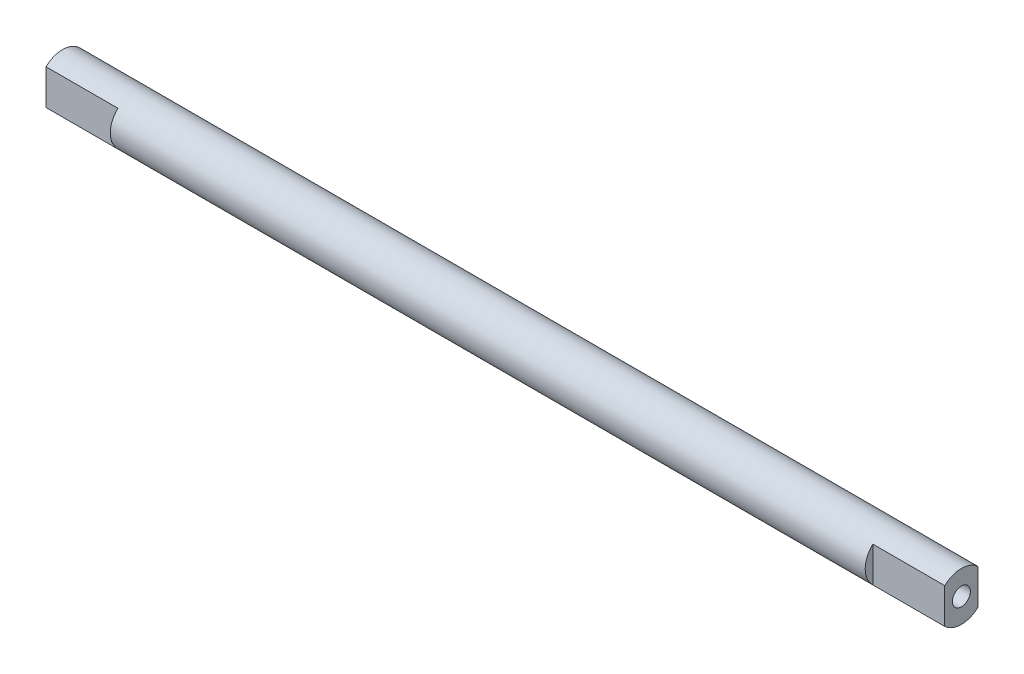
ISO-10303-21;
HEADER;
FILE_DESCRIPTION(('STEP AP214'),'2;1');
FILE_NAME('part.step','',(''),(''),'','','');
FILE_SCHEMA(('AUTOMOTIVE_DESIGN { 1 0 10303 214 1 1 1 1 }'));
ENDSEC;
DATA;
#1=APPLICATION_CONTEXT('core data for automotive mechanical design processes');
#2=APPLICATION_PROTOCOL_DEFINITION('international standard','automotive_design',2000,#1);
#3=PRODUCT_CONTEXT('',#1,'mechanical');
#4=PRODUCT('Part','Part','',(#3));
#5=PRODUCT_RELATED_PRODUCT_CATEGORY('part','',(#4));
#6=PRODUCT_DEFINITION_FORMATION('','',#4);
#7=PRODUCT_DEFINITION_CONTEXT('part definition',#1,'design');
#8=PRODUCT_DEFINITION('design','',#6,#7);
#9=PRODUCT_DEFINITION_SHAPE('','',#8);
#10=(LENGTH_UNIT() NAMED_UNIT(*) SI_UNIT(.MILLI.,.METRE.));
#11=(NAMED_UNIT(*) PLANE_ANGLE_UNIT() SI_UNIT($,.RADIAN.));
#12=(NAMED_UNIT(*) SI_UNIT($,.STERADIAN.) SOLID_ANGLE_UNIT());
#13=UNCERTAINTY_MEASURE_WITH_UNIT(LENGTH_MEASURE(1.E-05),#10,'distance_accuracy_value','');
#14=(GEOMETRIC_REPRESENTATION_CONTEXT(3) GLOBAL_UNCERTAINTY_ASSIGNED_CONTEXT((#13)) GLOBAL_UNIT_ASSIGNED_CONTEXT((#10,
#11,#12)) REPRESENTATION_CONTEXT('',''));
#15=CARTESIAN_POINT('',(0.,0.,0.));
#16=DIRECTION('',(0.,0.,1.));
#17=DIRECTION('',(1.,0.,0.));
#18=AXIS2_PLACEMENT_3D('',#15,#16,#17);
#19=CARTESIAN_POINT('',(50.,0.,0.));
#20=DIRECTION('',(-1.,0.,0.));
#21=DIRECTION('',(0.,0.,1.));
#22=AXIS2_PLACEMENT_3D('',#19,#20,#21);
#23=CYLINDRICAL_SURFACE('',#22,2.7);
#24=CARTESIAN_POINT('',(50.,0.,0.));
#25=DIRECTION('',(1.,0.,0.));
#26=DIRECTION('',(0.,0.,-1.));
#27=AXIS2_PLACEMENT_3D('',#24,#25,#26);
#28=CIRCLE('',#27,2.7);
#29=CARTESIAN_POINT('',(50.,-1.96659604392971,1.85));
#30=VERTEX_POINT('',#29);
#31=CARTESIAN_POINT('',(50.,-1.96659604392971,-1.85));
#32=VERTEX_POINT('',#31);
#33=EDGE_CURVE('E52',#30,#32,#28,.T.);
#34=ORIENTED_EDGE('',*,*,#33,.F.);
#35=DIRECTION('',(1.,0.,0.));
#36=VECTOR('',#35,1.);
#37=CARTESIAN_POINT('',(42.,-1.96659604392971,1.85));
#38=LINE('',#37,#36);
#39=CARTESIAN_POINT('',(42.,-1.96659604392971,1.85));
#40=VERTEX_POINT('',#39);
#41=EDGE_CURVE('E164',#40,#30,#38,.T.);
#42=ORIENTED_EDGE('',*,*,#41,.F.);
#43=CARTESIAN_POINT('',(42.,0.,0.));
#44=DIRECTION('',(1.,0.,0.));
#45=DIRECTION('',(0.,0.,-1.));
#46=AXIS2_PLACEMENT_3D('',#43,#44,#45);
#47=CIRCLE('',#46,2.7);
#48=CARTESIAN_POINT('',(42.,1.96659604392971,1.85));
#49=VERTEX_POINT('',#48);
#50=EDGE_CURVE('E156',#49,#40,#47,.T.);
#51=ORIENTED_EDGE('',*,*,#50,.F.);
#52=DIRECTION('',(1.,0.,0.));
#53=VECTOR('',#52,1.);
#54=CARTESIAN_POINT('',(42.,1.96659604392971,1.85));
#55=LINE('',#54,#53);
#56=CARTESIAN_POINT('',(50.,1.96659604392971,1.85));
#57=VERTEX_POINT('',#56);
#58=EDGE_CURVE('E168',#49,#57,#55,.T.);
#59=ORIENTED_EDGE('',*,*,#58,.T.);
#60=CARTESIAN_POINT('',(50.,1.96659604392971,-1.85));
#61=VERTEX_POINT('',#60);
#62=EDGE_CURVE('E11',#61,#57,#28,.T.);
#63=ORIENTED_EDGE('',*,*,#62,.F.);
#64=DIRECTION('',(1.,0.,0.));
#65=VECTOR('',#64,1.);
#66=CARTESIAN_POINT('',(42.,1.96659604392971,-1.85));
#67=LINE('',#66,#65);
#68=CARTESIAN_POINT('',(42.,1.96659604392971,-1.85));
#69=VERTEX_POINT('',#68);
#70=EDGE_CURVE('E182',#69,#61,#67,.T.);
#71=ORIENTED_EDGE('',*,*,#70,.F.);
#72=CARTESIAN_POINT('',(42.,0.,0.));
#73=DIRECTION('',(1.,0.,0.));
#74=DIRECTION('',(0.,0.,-1.));
#75=AXIS2_PLACEMENT_3D('',#72,#73,#74);
#76=CIRCLE('',#75,2.7);
#77=CARTESIAN_POINT('',(42.,-1.96659604392971,-1.85));
#78=VERTEX_POINT('',#77);
#79=EDGE_CURVE('E175',#78,#69,#76,.T.);
#80=ORIENTED_EDGE('',*,*,#79,.F.);
#81=DIRECTION('',(1.,0.,0.));
#82=VECTOR('',#81,1.);
#83=CARTESIAN_POINT('',(42.,-1.96659604392971,-1.85));
#84=LINE('',#83,#82);
#85=EDGE_CURVE('E167',#78,#32,#84,.T.);
#86=ORIENTED_EDGE('',*,*,#85,.T.);
#87=EDGE_LOOP('',(#34,#42,#51,#59,#63,#71,#80,#86));
#88=FACE_BOUND('',#87,.T.);
#89=DIRECTION('',(-1.,0.,0.));
#90=VECTOR('',#89,1.);
#91=CARTESIAN_POINT('',(-42.,1.96659604392971,1.85));
#92=LINE('',#91,#90);
#93=CARTESIAN_POINT('',(-42.,1.96659604392971,1.85));
#94=VERTEX_POINT('',#93);
#95=CARTESIAN_POINT('',(-50.,1.96659604392971,1.85));
#96=VERTEX_POINT('',#95);
#97=EDGE_CURVE('E67',#94,#96,#92,.T.);
#98=ORIENTED_EDGE('',*,*,#97,.F.);
#99=CARTESIAN_POINT('',(-42.,0.,0.));
#100=DIRECTION('',(1.,0.,0.));
#101=DIRECTION('',(0.,0.,-1.));
#102=AXIS2_PLACEMENT_3D('',#99,#100,#101);
#103=CIRCLE('',#102,2.7);
#104=CARTESIAN_POINT('',(-42.,-1.96659604392971,1.85));
#105=VERTEX_POINT('',#104);
#106=EDGE_CURVE('E115',#94,#105,#103,.T.);
#107=ORIENTED_EDGE('',*,*,#106,.T.);
#108=DIRECTION('',(-1.,0.,0.));
#109=VECTOR('',#108,1.);
#110=CARTESIAN_POINT('',(-42.,-1.96659604392971,1.85));
#111=LINE('',#110,#109);
#112=CARTESIAN_POINT('',(-50.,-1.96659604392971,1.85));
#113=VERTEX_POINT('',#112);
#114=EDGE_CURVE('E111',#105,#113,#111,.T.);
#115=ORIENTED_EDGE('',*,*,#114,.T.);
#116=CARTESIAN_POINT('',(-50.,0.,0.));
#117=DIRECTION('',(1.,0.,0.));
#118=DIRECTION('',(0.,0.,-1.));
#119=AXIS2_PLACEMENT_3D('',#116,#117,#118);
#120=CIRCLE('',#119,2.7);
#121=CARTESIAN_POINT('',(-50.,-1.96659604392971,-1.85));
#122=VERTEX_POINT('',#121);
#123=EDGE_CURVE('E172',#113,#122,#120,.T.);
#124=ORIENTED_EDGE('',*,*,#123,.T.);
#125=DIRECTION('',(-1.,0.,0.));
#126=VECTOR('',#125,1.);
#127=CARTESIAN_POINT('',(-42.,-1.96659604392971,-1.85));
#128=LINE('',#127,#126);
#129=CARTESIAN_POINT('',(-42.,-1.96659604392971,-1.85));
#130=VERTEX_POINT('',#129);
#131=EDGE_CURVE('E59',#130,#122,#128,.T.);
#132=ORIENTED_EDGE('',*,*,#131,.F.);
#133=CARTESIAN_POINT('',(-42.,0.,0.));
#134=DIRECTION('',(1.,0.,0.));
#135=DIRECTION('',(0.,0.,-1.));
#136=AXIS2_PLACEMENT_3D('',#133,#134,#135);
#137=CIRCLE('',#136,2.7);
#138=CARTESIAN_POINT('',(-42.,1.96659604392971,-1.85));
#139=VERTEX_POINT('',#138);
#140=EDGE_CURVE('E132',#130,#139,#137,.T.);
#141=ORIENTED_EDGE('',*,*,#140,.T.);
#142=DIRECTION('',(-1.,0.,0.));
#143=VECTOR('',#142,1.);
#144=CARTESIAN_POINT('',(-42.,1.96659604392971,-1.85));
#145=LINE('',#144,#143);
#146=CARTESIAN_POINT('',(-50.,1.96659604392971,-1.85));
#147=VERTEX_POINT('',#146);
#148=EDGE_CURVE('E143',#139,#147,#145,.T.);
#149=ORIENTED_EDGE('',*,*,#148,.T.);
#150=EDGE_CURVE('E46',#147,#96,#120,.T.);
#151=ORIENTED_EDGE('',*,*,#150,.T.);
#152=EDGE_LOOP('',(#98,#107,#115,#124,#132,#141,#149,#151));
#153=FACE_BOUND('',#152,.T.);
#154=ADVANCED_FACE('F43',(#88,#153),#23,.T.);
#155=CARTESIAN_POINT('',(-50.,0.,0.));
#156=DIRECTION('',(1.,0.,0.));
#157=DIRECTION('',(0.,0.,-1.));
#158=AXIS2_PLACEMENT_3D('',#155,#156,#157);
#159=PLANE('',#158);
#160=CARTESIAN_POINT('',(-50.,0.,0.));
#161=DIRECTION('',(1.,0.,0.));
#162=DIRECTION('',(0.,0.,-1.));
#163=AXIS2_PLACEMENT_3D('',#160,#161,#162);
#164=CIRCLE('',#163,1.);
#165=CARTESIAN_POINT('',(-50.,0.,-1.));
#166=VERTEX_POINT('',#165);
#167=EDGE_CURVE('E388',#166,#166,#164,.T.);
#168=ORIENTED_EDGE('',*,*,#167,.T.);
#169=EDGE_LOOP('',(#168));
#170=FACE_BOUND('',#169,.T.);
#171=DIRECTION('',(0.,1.,0.));
#172=VECTOR('',#171,1.);
#173=CARTESIAN_POINT('',(-50.,1.96659604392971,1.85));
#174=LINE('',#173,#172);
#175=EDGE_CURVE('E120',#113,#96,#174,.T.);
#176=ORIENTED_EDGE('',*,*,#175,.T.);
#177=ORIENTED_EDGE('',*,*,#150,.F.);
#178=DIRECTION('',(0.,-1.,0.));
#179=VECTOR('',#178,1.);
#180=CARTESIAN_POINT('',(-50.,1.96659604392971,-1.85));
#181=LINE('',#180,#179);
#182=EDGE_CURVE('E137',#147,#122,#181,.T.);
#183=ORIENTED_EDGE('',*,*,#182,.T.);
#184=ORIENTED_EDGE('',*,*,#123,.F.);
#185=EDGE_LOOP('',(#176,#177,#183,#184));
#186=FACE_BOUND('',#185,.T.);
#187=ADVANCED_FACE('F222',(#170,#186),#159,.F.);
#188=CARTESIAN_POINT('',(50.,0.,0.));
#189=DIRECTION('',(1.,0.,0.));
#190=DIRECTION('',(0.,0.,-1.));
#191=AXIS2_PLACEMENT_3D('',#188,#189,#190);
#192=PLANE('',#191);
#193=CARTESIAN_POINT('',(50.,0.,0.));
#194=DIRECTION('',(1.,0.,0.));
#195=DIRECTION('',(0.,0.,-1.));
#196=AXIS2_PLACEMENT_3D('',#193,#194,#195);
#197=CIRCLE('',#196,1.);
#198=CARTESIAN_POINT('',(50.,0.,-1.));
#199=VERTEX_POINT('',#198);
#200=EDGE_CURVE('E128',#199,#199,#197,.T.);
#201=ORIENTED_EDGE('',*,*,#200,.F.);
#202=EDGE_LOOP('',(#201));
#203=FACE_BOUND('',#202,.T.);
#204=DIRECTION('',(0.,1.,0.));
#205=VECTOR('',#204,1.);
#206=CARTESIAN_POINT('',(50.,1.96659604392971,1.85));
#207=LINE('',#206,#205);
#208=EDGE_CURVE('E160',#30,#57,#207,.T.);
#209=ORIENTED_EDGE('',*,*,#208,.F.);
#210=ORIENTED_EDGE('',*,*,#33,.T.);
#211=DIRECTION('',(0.,-1.,0.));
#212=VECTOR('',#211,1.);
#213=CARTESIAN_POINT('',(50.,1.96659604392971,-1.85));
#214=LINE('',#213,#212);
#215=EDGE_CURVE('E152',#61,#32,#214,.T.);
#216=ORIENTED_EDGE('',*,*,#215,.F.);
#217=ORIENTED_EDGE('',*,*,#62,.T.);
#218=EDGE_LOOP('',(#209,#210,#216,#217));
#219=FACE_BOUND('',#218,.T.);
#220=ADVANCED_FACE('F200',(#203,#219),#192,.T.);
#221=CARTESIAN_POINT('',(42.,1.96659604392971,-1.85));
#222=DIRECTION('',(0.,0.,1.));
#223=DIRECTION('',(1.,0.,0.));
#224=AXIS2_PLACEMENT_3D('',#221,#222,#223);
#225=PLANE('',#224);
#226=ORIENTED_EDGE('',*,*,#215,.T.);
#227=ORIENTED_EDGE('',*,*,#85,.F.);
#228=DIRECTION('',(0.,-1.,0.));
#229=VECTOR('',#228,1.);
#230=CARTESIAN_POINT('',(42.,1.96659604392971,-1.85));
#231=LINE('',#230,#229);
#232=EDGE_CURVE('E178',#69,#78,#231,.T.);
#233=ORIENTED_EDGE('',*,*,#232,.F.);
#234=ORIENTED_EDGE('',*,*,#70,.T.);
#235=EDGE_LOOP('',(#226,#227,#233,#234));
#236=FACE_BOUND('',#235,.T.);
#237=ADVANCED_FACE('F193',(#236),#225,.F.);
#238=CARTESIAN_POINT('',(42.,0.,0.));
#239=DIRECTION('',(1.,0.,0.));
#240=DIRECTION('',(0.,0.,-1.));
#241=AXIS2_PLACEMENT_3D('',#238,#239,#240);
#242=PLANE('',#241);
#243=ORIENTED_EDGE('',*,*,#79,.T.);
#244=ORIENTED_EDGE('',*,*,#232,.T.);
#245=EDGE_LOOP('',(#243,#244));
#246=FACE_BOUND('',#245,.T.);
#247=ADVANCED_FACE('F219',(#246),#242,.T.);
#248=CARTESIAN_POINT('',(42.,1.96659604392971,1.85));
#249=DIRECTION('',(0.,0.,-1.));
#250=DIRECTION('',(-1.,0.,0.));
#251=AXIS2_PLACEMENT_3D('',#248,#249,#250);
#252=PLANE('',#251);
#253=ORIENTED_EDGE('',*,*,#208,.T.);
#254=ORIENTED_EDGE('',*,*,#58,.F.);
#255=DIRECTION('',(0.,1.,0.));
#256=VECTOR('',#255,1.);
#257=CARTESIAN_POINT('',(42.,1.96659604392971,1.85));
#258=LINE('',#257,#256);
#259=EDGE_CURVE('E159',#40,#49,#258,.T.);
#260=ORIENTED_EDGE('',*,*,#259,.F.);
#261=ORIENTED_EDGE('',*,*,#41,.T.);
#262=EDGE_LOOP('',(#253,#254,#260,#261));
#263=FACE_BOUND('',#262,.T.);
#264=ADVANCED_FACE('F206',(#263),#252,.F.);
#265=CARTESIAN_POINT('',(42.,0.,0.));
#266=DIRECTION('',(1.,0.,0.));
#267=DIRECTION('',(0.,0.,-1.));
#268=AXIS2_PLACEMENT_3D('',#265,#266,#267);
#269=PLANE('',#268);
#270=ORIENTED_EDGE('',*,*,#50,.T.);
#271=ORIENTED_EDGE('',*,*,#259,.T.);
#272=EDGE_LOOP('',(#270,#271));
#273=FACE_BOUND('',#272,.T.);
#274=ADVANCED_FACE('F208',(#273),#269,.T.);
#275=CARTESIAN_POINT('',(44.,0.,0.));
#276=DIRECTION('',(1.,0.,0.));
#277=DIRECTION('',(0.,0.,-1.));
#278=AXIS2_PLACEMENT_3D('',#275,#276,#277);
#279=CYLINDRICAL_SURFACE('',#278,1.);
#280=CARTESIAN_POINT('',(44.,0.,0.));
#281=DIRECTION('',(1.,0.,0.));
#282=DIRECTION('',(0.,0.,-1.));
#283=AXIS2_PLACEMENT_3D('',#280,#281,#282);
#284=CIRCLE('',#283,1.);
#285=CARTESIAN_POINT('',(44.,0.,-1.));
#286=VERTEX_POINT('',#285);
#287=EDGE_CURVE('E148',#286,#286,#284,.T.);
#288=ORIENTED_EDGE('',*,*,#287,.F.);
#289=EDGE_LOOP('',(#288));
#290=FACE_BOUND('',#289,.T.);
#291=ORIENTED_EDGE('',*,*,#200,.T.);
#292=EDGE_LOOP('',(#291));
#293=FACE_BOUND('',#292,.T.);
#294=ADVANCED_FACE('F210',(#290,#293),#279,.F.);
#295=CARTESIAN_POINT('',(44.,0.,0.));
#296=DIRECTION('',(1.,0.,0.));
#297=DIRECTION('',(0.,0.,-1.));
#298=AXIS2_PLACEMENT_3D('',#295,#296,#297);
#299=PLANE('',#298);
#300=ORIENTED_EDGE('',*,*,#287,.T.);
#301=EDGE_LOOP('',(#300));
#302=FACE_BOUND('',#301,.T.);
#303=ADVANCED_FACE('F216',(#302),#299,.T.);
#304=CARTESIAN_POINT('',(-42.,1.96659604392971,-1.85));
#305=DIRECTION('',(0.,0.,-1.));
#306=DIRECTION('',(-1.,0.,0.));
#307=AXIS2_PLACEMENT_3D('',#304,#305,#306);
#308=PLANE('',#307);
#309=ORIENTED_EDGE('',*,*,#182,.F.);
#310=ORIENTED_EDGE('',*,*,#148,.F.);
#311=DIRECTION('',(0.,-1.,0.));
#312=VECTOR('',#311,1.);
#313=CARTESIAN_POINT('',(-42.,1.96659604392971,-1.85));
#314=LINE('',#313,#312);
#315=EDGE_CURVE('E136',#139,#130,#314,.T.);
#316=ORIENTED_EDGE('',*,*,#315,.T.);
#317=ORIENTED_EDGE('',*,*,#131,.T.);
#318=EDGE_LOOP('',(#309,#310,#316,#317));
#319=FACE_BOUND('',#318,.T.);
#320=ADVANCED_FACE('F247',(#319),#308,.T.);
#321=CARTESIAN_POINT('',(-42.,0.,0.));
#322=DIRECTION('',(-1.,0.,0.));
#323=DIRECTION('',(0.,0.,-1.));
#324=AXIS2_PLACEMENT_3D('',#321,#322,#323);
#325=PLANE('',#324);
#326=ORIENTED_EDGE('',*,*,#140,.F.);
#327=ORIENTED_EDGE('',*,*,#315,.F.);
#328=EDGE_LOOP('',(#326,#327));
#329=FACE_BOUND('',#328,.T.);
#330=ADVANCED_FACE('F250',(#329),#325,.T.);
#331=CARTESIAN_POINT('',(-42.,1.96659604392971,1.85));
#332=DIRECTION('',(0.,0.,1.));
#333=DIRECTION('',(1.,0.,0.));
#334=AXIS2_PLACEMENT_3D('',#331,#332,#333);
#335=PLANE('',#334);
#336=ORIENTED_EDGE('',*,*,#175,.F.);
#337=ORIENTED_EDGE('',*,*,#114,.F.);
#338=DIRECTION('',(0.,1.,0.));
#339=VECTOR('',#338,1.);
#340=CARTESIAN_POINT('',(-42.,1.96659604392971,1.85));
#341=LINE('',#340,#339);
#342=EDGE_CURVE('E107',#105,#94,#341,.T.);
#343=ORIENTED_EDGE('',*,*,#342,.T.);
#344=ORIENTED_EDGE('',*,*,#97,.T.);
#345=EDGE_LOOP('',(#336,#337,#343,#344));
#346=FACE_BOUND('',#345,.T.);
#347=ADVANCED_FACE('F109',(#346),#335,.T.);
#348=CARTESIAN_POINT('',(-42.,0.,0.));
#349=DIRECTION('',(-1.,0.,0.));
#350=DIRECTION('',(0.,0.,-1.));
#351=AXIS2_PLACEMENT_3D('',#348,#349,#350);
#352=PLANE('',#351);
#353=ORIENTED_EDGE('',*,*,#106,.F.);
#354=ORIENTED_EDGE('',*,*,#342,.F.);
#355=EDGE_LOOP('',(#353,#354));
#356=FACE_BOUND('',#355,.T.);
#357=ADVANCED_FACE('F117',(#356),#352,.T.);
#358=CARTESIAN_POINT('',(-44.,0.,0.));
#359=DIRECTION('',(-1.,0.,0.));
#360=DIRECTION('',(0.,0.,1.));
#361=AXIS2_PLACEMENT_3D('',#358,#359,#360);
#362=CYLINDRICAL_SURFACE('',#361,1.);
#363=CARTESIAN_POINT('',(-44.,0.,0.));
#364=DIRECTION('',(1.,0.,0.));
#365=DIRECTION('',(0.,0.,-1.));
#366=AXIS2_PLACEMENT_3D('',#363,#364,#365);
#367=CIRCLE('',#366,1.);
#368=CARTESIAN_POINT('',(-44.,0.,-1.));
#369=VERTEX_POINT('',#368);
#370=EDGE_CURVE('E142',#369,#369,#367,.T.);
#371=ORIENTED_EDGE('',*,*,#370,.T.);
#372=EDGE_LOOP('',(#371));
#373=FACE_BOUND('',#372,.T.);
#374=ORIENTED_EDGE('',*,*,#167,.F.);
#375=EDGE_LOOP('',(#374));
#376=FACE_BOUND('',#375,.T.);
#377=ADVANCED_FACE('F299',(#373,#376),#362,.F.);
#378=CARTESIAN_POINT('',(-44.,0.,0.));
#379=DIRECTION('',(-1.,0.,0.));
#380=DIRECTION('',(0.,0.,-1.));
#381=AXIS2_PLACEMENT_3D('',#378,#379,#380);
#382=PLANE('',#381);
#383=ORIENTED_EDGE('',*,*,#370,.F.);
#384=EDGE_LOOP('',(#383));
#385=FACE_BOUND('',#384,.T.);
#386=ADVANCED_FACE('F308',(#385),#382,.T.);
#387=CLOSED_SHELL('',(#154,#187,#220,#237,#247,#264,#274,#294,#303,#320,#330,#347,#357,#377,#386));
#388=MANIFOLD_SOLID_BREP('B2',#387);
#389=ADVANCED_BREP_SHAPE_REPRESENTATION('',(#18,#388),#14);
#390=SHAPE_DEFINITION_REPRESENTATION(#9,#389);
ENDSEC;
END-ISO-10303-21;
